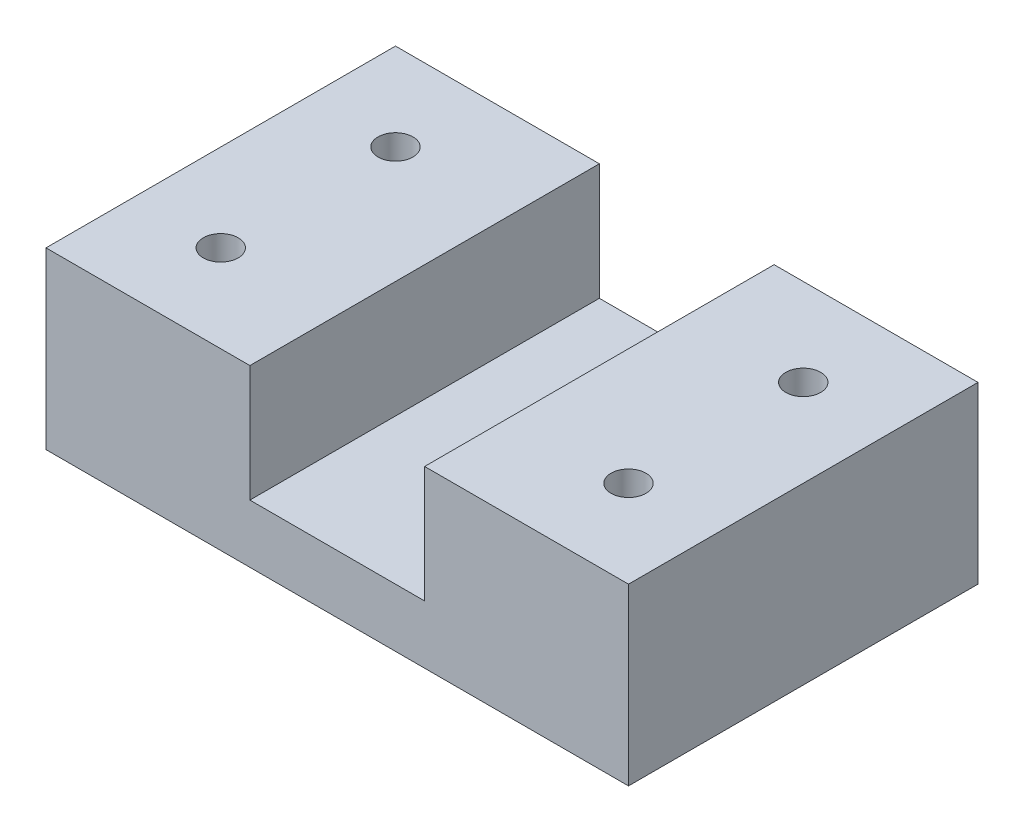
ISO-10303-21;
HEADER;
FILE_DESCRIPTION(('STEP AP214'),'2;1');
FILE_NAME('part.step','',(''),(''),'','','');
FILE_SCHEMA(('AUTOMOTIVE_DESIGN { 1 0 10303 214 1 1 1 1 }'));
ENDSEC;
DATA;
#1=APPLICATION_CONTEXT('core data for automotive mechanical design processes');
#2=APPLICATION_PROTOCOL_DEFINITION('international standard','automotive_design',2000,#1);
#3=PRODUCT_CONTEXT('',#1,'mechanical');
#4=PRODUCT('Part','Part','',(#3));
#5=PRODUCT_RELATED_PRODUCT_CATEGORY('part','',(#4));
#6=PRODUCT_DEFINITION_FORMATION('','',#4);
#7=PRODUCT_DEFINITION_CONTEXT('part definition',#1,'design');
#8=PRODUCT_DEFINITION('design','',#6,#7);
#9=PRODUCT_DEFINITION_SHAPE('','',#8);
#10=(LENGTH_UNIT() NAMED_UNIT(*) SI_UNIT(.MILLI.,.METRE.));
#11=(NAMED_UNIT(*) PLANE_ANGLE_UNIT() SI_UNIT($,.RADIAN.));
#12=(NAMED_UNIT(*) SI_UNIT($,.STERADIAN.) SOLID_ANGLE_UNIT());
#13=UNCERTAINTY_MEASURE_WITH_UNIT(LENGTH_MEASURE(1.E-05),#10,'distance_accuracy_value','');
#14=(GEOMETRIC_REPRESENTATION_CONTEXT(3) GLOBAL_UNCERTAINTY_ASSIGNED_CONTEXT((#13)) GLOBAL_UNIT_ASSIGNED_CONTEXT((#10,
#11,#12)) REPRESENTATION_CONTEXT('',''));
#15=CARTESIAN_POINT('',(0.,0.,0.));
#16=DIRECTION('',(0.,0.,1.));
#17=DIRECTION('',(1.,0.,0.));
#18=AXIS2_PLACEMENT_3D('',#15,#16,#17);
#19=CARTESIAN_POINT('',(0.,0.5,0.));
#20=DIRECTION('',(0.,1.,0.));
#21=DIRECTION('',(0.,0.,1.));
#22=AXIS2_PLACEMENT_3D('',#19,#20,#21);
#23=PLANE('',#22);
#24=DIRECTION('',(-1.,0.,0.));
#25=VECTOR('',#24,1.);
#26=CARTESIAN_POINT('',(-2.5,0.5,-1.5));
#27=LINE('',#26,#25);
#28=CARTESIAN_POINT('',(0.75,0.5,-1.5));
#29=VERTEX_POINT('',#28);
#30=CARTESIAN_POINT('',(-0.75,0.5,-1.5));
#31=VERTEX_POINT('',#30);
#32=EDGE_CURVE('E152',#29,#31,#27,.T.);
#33=ORIENTED_EDGE('',*,*,#32,.T.);
#34=DIRECTION('',(0.,0.,1.));
#35=VECTOR('',#34,1.);
#36=CARTESIAN_POINT('',(-0.75,0.5,0.));
#37=LINE('',#36,#35);
#38=CARTESIAN_POINT('',(-0.75,0.5,1.5));
#39=VERTEX_POINT('',#38);
#40=EDGE_CURVE('E11',#31,#39,#37,.T.);
#41=ORIENTED_EDGE('',*,*,#40,.T.);
#42=DIRECTION('',(1.,0.,0.));
#43=VECTOR('',#42,1.);
#44=CARTESIAN_POINT('',(-2.5,0.5,1.5));
#45=LINE('',#44,#43);
#46=CARTESIAN_POINT('',(0.75,0.5,1.5));
#47=VERTEX_POINT('',#46);
#48=EDGE_CURVE('E160',#39,#47,#45,.T.);
#49=ORIENTED_EDGE('',*,*,#48,.T.);
#50=DIRECTION('',(0.,0.,-1.));
#51=VECTOR('',#50,1.);
#52=CARTESIAN_POINT('',(0.75,0.5,0.));
#53=LINE('',#52,#51);
#54=EDGE_CURVE('E50',#47,#29,#53,.T.);
#55=ORIENTED_EDGE('',*,*,#54,.T.);
#56=EDGE_LOOP('',(#33,#41,#49,#55));
#57=FACE_BOUND('',#56,.T.);
#58=ADVANCED_FACE('F39',(#57),#23,.T.);
#59=CARTESIAN_POINT('',(2.5,0.5,-1.5));
#60=DIRECTION('',(-1.,0.,0.));
#61=DIRECTION('',(0.,0.,1.));
#62=AXIS2_PLACEMENT_3D('',#59,#60,#61);
#63=PLANE('',#62);
#64=DIRECTION('',(0.,0.,-1.));
#65=VECTOR('',#64,1.);
#66=CARTESIAN_POINT('',(2.5,0.,-1.5));
#67=LINE('',#66,#65);
#68=CARTESIAN_POINT('',(2.5,0.,1.5));
#69=VERTEX_POINT('',#68);
#70=CARTESIAN_POINT('',(2.5,0.,-1.5));
#71=VERTEX_POINT('',#70);
#72=EDGE_CURVE('E141',#69,#71,#67,.T.);
#73=ORIENTED_EDGE('',*,*,#72,.T.);
#74=DIRECTION('',(0.,-1.,0.));
#75=VECTOR('',#74,1.);
#76=CARTESIAN_POINT('',(2.5,0.5,-1.5));
#77=LINE('',#76,#75);
#78=CARTESIAN_POINT('',(2.5,1.5,-1.5));
#79=VERTEX_POINT('',#78);
#80=EDGE_CURVE('E168',#79,#71,#77,.T.);
#81=ORIENTED_EDGE('',*,*,#80,.F.);
#82=DIRECTION('',(0.,0.,-1.));
#83=VECTOR('',#82,1.);
#84=CARTESIAN_POINT('',(2.5,1.5,-1.5));
#85=LINE('',#84,#83);
#86=CARTESIAN_POINT('',(2.5,1.5,1.5));
#87=VERTEX_POINT('',#86);
#88=EDGE_CURVE('E126',#87,#79,#85,.T.);
#89=ORIENTED_EDGE('',*,*,#88,.F.);
#90=DIRECTION('',(0.,-1.,0.));
#91=VECTOR('',#90,1.);
#92=CARTESIAN_POINT('',(2.5,0.5,1.5));
#93=LINE('',#92,#91);
#94=EDGE_CURVE('E117',#87,#69,#93,.T.);
#95=ORIENTED_EDGE('',*,*,#94,.T.);
#96=EDGE_LOOP('',(#73,#81,#89,#95));
#97=FACE_BOUND('',#96,.T.);
#98=ADVANCED_FACE('F41',(#97),#63,.F.);
#99=CARTESIAN_POINT('',(-2.5,0.5,-1.5));
#100=DIRECTION('',(0.,0.,1.));
#101=DIRECTION('',(1.,0.,0.));
#102=AXIS2_PLACEMENT_3D('',#99,#100,#101);
#103=PLANE('',#102);
#104=DIRECTION('',(0.,-1.,0.));
#105=VECTOR('',#104,1.);
#106=CARTESIAN_POINT('',(-2.5,0.5,-1.5));
#107=LINE('',#106,#105);
#108=CARTESIAN_POINT('',(-2.5,1.5,-1.5));
#109=VERTEX_POINT('',#108);
#110=CARTESIAN_POINT('',(-2.5,0.,-1.5));
#111=VERTEX_POINT('',#110);
#112=EDGE_CURVE('E113',#109,#111,#107,.T.);
#113=ORIENTED_EDGE('',*,*,#112,.F.);
#114=DIRECTION('',(-1.,0.,0.));
#115=VECTOR('',#114,1.);
#116=CARTESIAN_POINT('',(-2.5,1.5,-1.5));
#117=LINE('',#116,#115);
#118=CARTESIAN_POINT('',(-0.75,1.5,-1.5));
#119=VERTEX_POINT('',#118);
#120=EDGE_CURVE('E130',#119,#109,#117,.T.);
#121=ORIENTED_EDGE('',*,*,#120,.F.);
#122=DIRECTION('',(0.,-1.,0.));
#123=VECTOR('',#122,1.);
#124=CARTESIAN_POINT('',(-0.75,1.5,-1.5));
#125=LINE('',#124,#123);
#126=EDGE_CURVE('E138',#119,#31,#125,.T.);
#127=ORIENTED_EDGE('',*,*,#126,.T.);
#128=ORIENTED_EDGE('',*,*,#32,.F.);
#129=DIRECTION('',(0.,-1.,0.));
#130=VECTOR('',#129,1.);
#131=CARTESIAN_POINT('',(0.75,1.5,-1.5));
#132=LINE('',#131,#130);
#133=CARTESIAN_POINT('',(0.75,1.5,-1.5));
#134=VERTEX_POINT('',#133);
#135=EDGE_CURVE('E62',#134,#29,#132,.T.);
#136=ORIENTED_EDGE('',*,*,#135,.F.);
#137=DIRECTION('',(-1.,0.,0.));
#138=VECTOR('',#137,1.);
#139=CARTESIAN_POINT('',(2.5,1.5,-1.5));
#140=LINE('',#139,#138);
#141=EDGE_CURVE('E132',#79,#134,#140,.T.);
#142=ORIENTED_EDGE('',*,*,#141,.F.);
#143=ORIENTED_EDGE('',*,*,#80,.T.);
#144=DIRECTION('',(-1.,0.,0.));
#145=VECTOR('',#144,1.);
#146=CARTESIAN_POINT('',(-2.5,0.,-1.5));
#147=LINE('',#146,#145);
#148=EDGE_CURVE('E162',#71,#111,#147,.T.);
#149=ORIENTED_EDGE('',*,*,#148,.T.);
#150=EDGE_LOOP('',(#113,#121,#127,#128,#136,#142,#143,#149));
#151=FACE_BOUND('',#150,.T.);
#152=ADVANCED_FACE('F176',(#151),#103,.F.);
#153=CARTESIAN_POINT('',(-2.5,0.5,-1.5));
#154=DIRECTION('',(1.,0.,0.));
#155=DIRECTION('',(0.,0.,-1.));
#156=AXIS2_PLACEMENT_3D('',#153,#154,#155);
#157=PLANE('',#156);
#158=DIRECTION('',(0.,0.,1.));
#159=VECTOR('',#158,1.);
#160=CARTESIAN_POINT('',(-2.5,0.,-1.5));
#161=LINE('',#160,#159);
#162=CARTESIAN_POINT('',(-2.5,0.,1.5));
#163=VERTEX_POINT('',#162);
#164=EDGE_CURVE('E115',#111,#163,#161,.T.);
#165=ORIENTED_EDGE('',*,*,#164,.T.);
#166=DIRECTION('',(0.,-1.,0.));
#167=VECTOR('',#166,1.);
#168=CARTESIAN_POINT('',(-2.5,0.5,1.5));
#169=LINE('',#168,#167);
#170=CARTESIAN_POINT('',(-2.5,1.5,1.5));
#171=VERTEX_POINT('',#170);
#172=EDGE_CURVE('E104',#171,#163,#169,.T.);
#173=ORIENTED_EDGE('',*,*,#172,.F.);
#174=DIRECTION('',(0.,0.,1.));
#175=VECTOR('',#174,1.);
#176=CARTESIAN_POINT('',(-2.5,1.5,-1.5));
#177=LINE('',#176,#175);
#178=EDGE_CURVE('E109',#109,#171,#177,.T.);
#179=ORIENTED_EDGE('',*,*,#178,.F.);
#180=ORIENTED_EDGE('',*,*,#112,.T.);
#181=EDGE_LOOP('',(#165,#173,#179,#180));
#182=FACE_BOUND('',#181,.T.);
#183=ADVANCED_FACE('F110',(#182),#157,.F.);
#184=CARTESIAN_POINT('',(-2.5,0.5,1.5));
#185=DIRECTION('',(0.,0.,-1.));
#186=DIRECTION('',(-1.,0.,0.));
#187=AXIS2_PLACEMENT_3D('',#184,#185,#186);
#188=PLANE('',#187);
#189=ORIENTED_EDGE('',*,*,#94,.F.);
#190=DIRECTION('',(1.,0.,0.));
#191=VECTOR('',#190,1.);
#192=CARTESIAN_POINT('',(2.5,1.5,1.5));
#193=LINE('',#192,#191);
#194=CARTESIAN_POINT('',(0.75,1.5,1.5));
#195=VERTEX_POINT('',#194);
#196=EDGE_CURVE('E146',#195,#87,#193,.T.);
#197=ORIENTED_EDGE('',*,*,#196,.F.);
#198=DIRECTION('',(0.,-1.,0.));
#199=VECTOR('',#198,1.);
#200=CARTESIAN_POINT('',(0.75,1.5,1.5));
#201=LINE('',#200,#199);
#202=EDGE_CURVE('E144',#195,#47,#201,.T.);
#203=ORIENTED_EDGE('',*,*,#202,.T.);
#204=ORIENTED_EDGE('',*,*,#48,.F.);
#205=DIRECTION('',(0.,-1.,0.));
#206=VECTOR('',#205,1.);
#207=CARTESIAN_POINT('',(-0.75,1.5,1.5));
#208=LINE('',#207,#206);
#209=CARTESIAN_POINT('',(-0.75,1.5,1.5));
#210=VERTEX_POINT('',#209);
#211=EDGE_CURVE('E53',#210,#39,#208,.T.);
#212=ORIENTED_EDGE('',*,*,#211,.F.);
#213=DIRECTION('',(1.,0.,0.));
#214=VECTOR('',#213,1.);
#215=CARTESIAN_POINT('',(-2.5,1.5,1.5));
#216=LINE('',#215,#214);
#217=EDGE_CURVE('E119',#171,#210,#216,.T.);
#218=ORIENTED_EDGE('',*,*,#217,.F.);
#219=ORIENTED_EDGE('',*,*,#172,.T.);
#220=DIRECTION('',(1.,0.,0.));
#221=VECTOR('',#220,1.);
#222=CARTESIAN_POINT('',(-2.5,0.,1.5));
#223=LINE('',#222,#221);
#224=EDGE_CURVE('E158',#163,#69,#223,.T.);
#225=ORIENTED_EDGE('',*,*,#224,.T.);
#226=EDGE_LOOP('',(#189,#197,#203,#204,#212,#218,#219,#225));
#227=FACE_BOUND('',#226,.T.);
#228=ADVANCED_FACE('F116',(#227),#188,.F.);
#229=CARTESIAN_POINT('',(0.,0.,0.));
#230=DIRECTION('',(0.,1.,0.));
#231=DIRECTION('',(0.,0.,1.));
#232=AXIS2_PLACEMENT_3D('',#229,#230,#231);
#233=PLANE('',#232);
#234=CARTESIAN_POINT('',(-1.75,0.,0.75));
#235=DIRECTION('',(0.,1.,0.));
#236=DIRECTION('',(0.,0.,-1.));
#237=AXIS2_PLACEMENT_3D('',#234,#235,#236);
#238=CIRCLE('',#237,0.15);
#239=CARTESIAN_POINT('',(-1.75,0.,0.6));
#240=VERTEX_POINT('',#239);
#241=EDGE_CURVE('E253',#240,#240,#238,.T.);
#242=ORIENTED_EDGE('',*,*,#241,.T.);
#243=EDGE_LOOP('',(#242));
#244=FACE_BOUND('',#243,.T.);
#245=CARTESIAN_POINT('',(1.75,0.,0.75));
#246=DIRECTION('',(0.,1.,0.));
#247=DIRECTION('',(0.,0.,1.));
#248=AXIS2_PLACEMENT_3D('',#245,#246,#247);
#249=CIRCLE('',#248,0.15);
#250=CARTESIAN_POINT('',(1.75,0.,0.9));
#251=VERTEX_POINT('',#250);
#252=EDGE_CURVE('E243',#251,#251,#249,.T.);
#253=ORIENTED_EDGE('',*,*,#252,.T.);
#254=EDGE_LOOP('',(#253));
#255=FACE_BOUND('',#254,.T.);
#256=CARTESIAN_POINT('',(1.75,0.,-0.75));
#257=DIRECTION('',(0.,1.,0.));
#258=DIRECTION('',(0.,0.,-1.));
#259=AXIS2_PLACEMENT_3D('',#256,#257,#258);
#260=CIRCLE('',#259,0.15);
#261=CARTESIAN_POINT('',(1.75,0.,-0.9));
#262=VERTEX_POINT('',#261);
#263=EDGE_CURVE('E233',#262,#262,#260,.T.);
#264=ORIENTED_EDGE('',*,*,#263,.T.);
#265=EDGE_LOOP('',(#264));
#266=FACE_BOUND('',#265,.T.);
#267=CARTESIAN_POINT('',(-1.75,0.,-0.75));
#268=DIRECTION('',(0.,1.,0.));
#269=DIRECTION('',(0.,0.,1.));
#270=AXIS2_PLACEMENT_3D('',#267,#268,#269);
#271=CIRCLE('',#270,0.15);
#272=CARTESIAN_POINT('',(-1.75,0.,-0.6));
#273=VERTEX_POINT('',#272);
#274=EDGE_CURVE('E131',#273,#273,#271,.T.);
#275=ORIENTED_EDGE('',*,*,#274,.T.);
#276=EDGE_LOOP('',(#275));
#277=FACE_BOUND('',#276,.T.);
#278=ORIENTED_EDGE('',*,*,#72,.F.);
#279=ORIENTED_EDGE('',*,*,#224,.F.);
#280=ORIENTED_EDGE('',*,*,#164,.F.);
#281=ORIENTED_EDGE('',*,*,#148,.F.);
#282=EDGE_LOOP('',(#278,#279,#280,#281));
#283=FACE_BOUND('',#282,.T.);
#284=ADVANCED_FACE('F189',(#244,#255,#266,#277,#283),#233,.F.);
#285=CARTESIAN_POINT('',(0.75,1.5,-1.5));
#286=DIRECTION('',(1.,0.,0.));
#287=DIRECTION('',(0.,0.,-1.));
#288=AXIS2_PLACEMENT_3D('',#285,#286,#287);
#289=PLANE('',#288);
#290=ORIENTED_EDGE('',*,*,#54,.F.);
#291=ORIENTED_EDGE('',*,*,#202,.F.);
#292=DIRECTION('',(0.,0.,1.));
#293=VECTOR('',#292,1.);
#294=CARTESIAN_POINT('',(0.75,1.5,-1.5));
#295=LINE('',#294,#293);
#296=EDGE_CURVE('E151',#134,#195,#295,.T.);
#297=ORIENTED_EDGE('',*,*,#296,.F.);
#298=ORIENTED_EDGE('',*,*,#135,.T.);
#299=EDGE_LOOP('',(#290,#291,#297,#298));
#300=FACE_BOUND('',#299,.T.);
#301=ADVANCED_FACE('F182',(#300),#289,.F.);
#302=CARTESIAN_POINT('',(0.,1.5,0.));
#303=DIRECTION('',(0.,-1.,0.));
#304=DIRECTION('',(0.,0.,-1.));
#305=AXIS2_PLACEMENT_3D('',#302,#303,#304);
#306=PLANE('',#305);
#307=CARTESIAN_POINT('',(1.75,1.5,0.75));
#308=DIRECTION('',(0.,1.,0.));
#309=DIRECTION('',(0.,0.,1.));
#310=AXIS2_PLACEMENT_3D('',#307,#308,#309);
#311=CIRCLE('',#310,0.15);
#312=CARTESIAN_POINT('',(1.75,1.5,0.9));
#313=VERTEX_POINT('',#312);
#314=EDGE_CURVE('E245',#313,#313,#311,.T.);
#315=ORIENTED_EDGE('',*,*,#314,.F.);
#316=EDGE_LOOP('',(#315));
#317=FACE_BOUND('',#316,.T.);
#318=CARTESIAN_POINT('',(1.75,1.5,-0.75));
#319=DIRECTION('',(0.,1.,0.));
#320=DIRECTION('',(0.,0.,-1.));
#321=AXIS2_PLACEMENT_3D('',#318,#319,#320);
#322=CIRCLE('',#321,0.15);
#323=CARTESIAN_POINT('',(1.75,1.5,-0.9));
#324=VERTEX_POINT('',#323);
#325=EDGE_CURVE('E240',#324,#324,#322,.T.);
#326=ORIENTED_EDGE('',*,*,#325,.F.);
#327=EDGE_LOOP('',(#326));
#328=FACE_BOUND('',#327,.T.);
#329=ORIENTED_EDGE('',*,*,#88,.T.);
#330=ORIENTED_EDGE('',*,*,#141,.T.);
#331=ORIENTED_EDGE('',*,*,#296,.T.);
#332=ORIENTED_EDGE('',*,*,#196,.T.);
#333=EDGE_LOOP('',(#329,#330,#331,#332));
#334=FACE_BOUND('',#333,.T.);
#335=ADVANCED_FACE('F181',(#317,#328,#334),#306,.F.);
#336=CARTESIAN_POINT('',(-0.75,1.5,-1.5));
#337=DIRECTION('',(-1.,0.,0.));
#338=DIRECTION('',(0.,0.,1.));
#339=AXIS2_PLACEMENT_3D('',#336,#337,#338);
#340=PLANE('',#339);
#341=ORIENTED_EDGE('',*,*,#40,.F.);
#342=ORIENTED_EDGE('',*,*,#126,.F.);
#343=DIRECTION('',(0.,0.,-1.));
#344=VECTOR('',#343,1.);
#345=CARTESIAN_POINT('',(-0.75,1.5,-1.5));
#346=LINE('',#345,#344);
#347=EDGE_CURVE('E125',#210,#119,#346,.T.);
#348=ORIENTED_EDGE('',*,*,#347,.F.);
#349=ORIENTED_EDGE('',*,*,#211,.T.);
#350=EDGE_LOOP('',(#341,#342,#348,#349));
#351=FACE_BOUND('',#350,.T.);
#352=ADVANCED_FACE('F178',(#351),#340,.F.);
#353=CARTESIAN_POINT('',(0.,1.5,0.));
#354=DIRECTION('',(0.,1.,0.));
#355=DIRECTION('',(0.,0.,1.));
#356=AXIS2_PLACEMENT_3D('',#353,#354,#355);
#357=PLANE('',#356);
#358=CARTESIAN_POINT('',(-1.75,1.5,0.75));
#359=DIRECTION('',(0.,1.,0.));
#360=DIRECTION('',(0.,0.,-1.));
#361=AXIS2_PLACEMENT_3D('',#358,#359,#360);
#362=CIRCLE('',#361,0.15);
#363=CARTESIAN_POINT('',(-1.75,1.5,0.6));
#364=VERTEX_POINT('',#363);
#365=EDGE_CURVE('E247',#364,#364,#362,.T.);
#366=ORIENTED_EDGE('',*,*,#365,.F.);
#367=EDGE_LOOP('',(#366));
#368=FACE_BOUND('',#367,.T.);
#369=CARTESIAN_POINT('',(-1.75,1.5,-0.75));
#370=DIRECTION('',(0.,1.,0.));
#371=DIRECTION('',(0.,0.,1.));
#372=AXIS2_PLACEMENT_3D('',#369,#370,#371);
#373=CIRCLE('',#372,0.15);
#374=CARTESIAN_POINT('',(-1.75,1.5,-0.6));
#375=VERTEX_POINT('',#374);
#376=EDGE_CURVE('E239',#375,#375,#373,.T.);
#377=ORIENTED_EDGE('',*,*,#376,.F.);
#378=EDGE_LOOP('',(#377));
#379=FACE_BOUND('',#378,.T.);
#380=ORIENTED_EDGE('',*,*,#178,.T.);
#381=ORIENTED_EDGE('',*,*,#217,.T.);
#382=ORIENTED_EDGE('',*,*,#347,.T.);
#383=ORIENTED_EDGE('',*,*,#120,.T.);
#384=EDGE_LOOP('',(#380,#381,#382,#383));
#385=FACE_BOUND('',#384,.T.);
#386=ADVANCED_FACE('F124',(#368,#379,#385),#357,.T.);
#387=CARTESIAN_POINT('',(-1.75,0.,-0.75));
#388=DIRECTION('',(0.,1.,0.));
#389=DIRECTION('',(0.,0.,1.));
#390=AXIS2_PLACEMENT_3D('',#387,#388,#389);
#391=CYLINDRICAL_SURFACE('',#390,0.15);
#392=ORIENTED_EDGE('',*,*,#274,.F.);
#393=EDGE_LOOP('',(#392));
#394=FACE_BOUND('',#393,.T.);
#395=ORIENTED_EDGE('',*,*,#376,.T.);
#396=EDGE_LOOP('',(#395));
#397=FACE_BOUND('',#396,.T.);
#398=ADVANCED_FACE('F213',(#394,#397),#391,.F.);
#399=CARTESIAN_POINT('',(-1.75,0.,0.75));
#400=DIRECTION('',(0.,1.,0.));
#401=DIRECTION('',(0.,0.,1.));
#402=AXIS2_PLACEMENT_3D('',#399,#400,#401);
#403=CYLINDRICAL_SURFACE('',#402,0.15);
#404=ORIENTED_EDGE('',*,*,#241,.F.);
#405=EDGE_LOOP('',(#404));
#406=FACE_BOUND('',#405,.T.);
#407=ORIENTED_EDGE('',*,*,#365,.T.);
#408=EDGE_LOOP('',(#407));
#409=FACE_BOUND('',#408,.T.);
#410=ADVANCED_FACE('F220',(#406,#409),#403,.F.);
#411=CARTESIAN_POINT('',(1.75,0.,-0.75));
#412=DIRECTION('',(0.,1.,0.));
#413=DIRECTION('',(0.,0.,1.));
#414=AXIS2_PLACEMENT_3D('',#411,#412,#413);
#415=CYLINDRICAL_SURFACE('',#414,0.15);
#416=ORIENTED_EDGE('',*,*,#263,.F.);
#417=EDGE_LOOP('',(#416));
#418=FACE_BOUND('',#417,.T.);
#419=ORIENTED_EDGE('',*,*,#325,.T.);
#420=EDGE_LOOP('',(#419));
#421=FACE_BOUND('',#420,.T.);
#422=ADVANCED_FACE('F222',(#418,#421),#415,.F.);
#423=CARTESIAN_POINT('',(1.75,0.,0.75));
#424=DIRECTION('',(0.,1.,0.));
#425=DIRECTION('',(0.,0.,1.));
#426=AXIS2_PLACEMENT_3D('',#423,#424,#425);
#427=CYLINDRICAL_SURFACE('',#426,0.15);
#428=ORIENTED_EDGE('',*,*,#252,.F.);
#429=EDGE_LOOP('',(#428));
#430=FACE_BOUND('',#429,.T.);
#431=ORIENTED_EDGE('',*,*,#314,.T.);
#432=EDGE_LOOP('',(#431));
#433=FACE_BOUND('',#432,.T.);
#434=ADVANCED_FACE('F224',(#430,#433),#427,.F.);
#435=CLOSED_SHELL('',(#58,#98,#152,#183,#228,#284,#301,#335,#352,#386,#398,#410,#422,#434));
#436=MANIFOLD_SOLID_BREP('B2',#435);
#437=ADVANCED_BREP_SHAPE_REPRESENTATION('',(#18,#436),#14);
#438=SHAPE_DEFINITION_REPRESENTATION(#9,#437);
ENDSEC;
END-ISO-10303-21;
